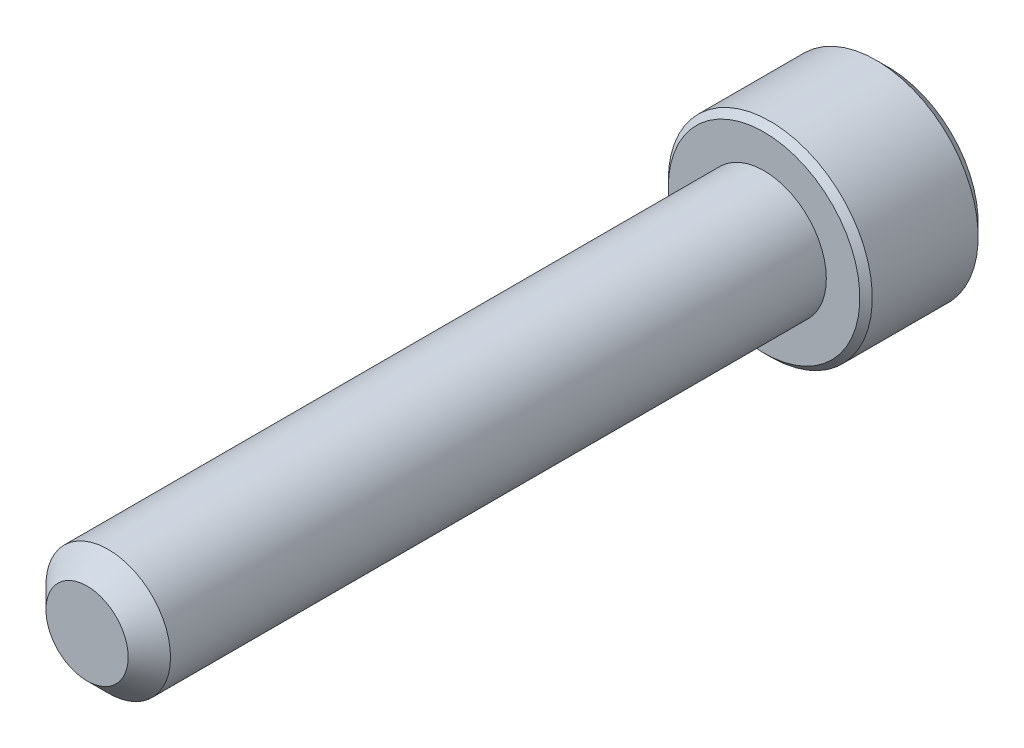
ISO-10303-21;
HEADER;
FILE_DESCRIPTION(('STEP AP214'),'2;1');
FILE_NAME('part.step','',(''),(''),'','','');
FILE_SCHEMA(('AUTOMOTIVE_DESIGN { 1 0 10303 214 1 1 1 1 }'));
ENDSEC;
DATA;
#1=APPLICATION_CONTEXT('core data for automotive mechanical design processes');
#2=APPLICATION_PROTOCOL_DEFINITION('international standard','automotive_design',2000,#1);
#3=PRODUCT_CONTEXT('',#1,'mechanical');
#4=PRODUCT('Part','Part','',(#3));
#5=PRODUCT_RELATED_PRODUCT_CATEGORY('part','',(#4));
#6=PRODUCT_DEFINITION_FORMATION('','',#4);
#7=PRODUCT_DEFINITION_CONTEXT('part definition',#1,'design');
#8=PRODUCT_DEFINITION('design','',#6,#7);
#9=PRODUCT_DEFINITION_SHAPE('','',#8);
#10=(LENGTH_UNIT() NAMED_UNIT(*) SI_UNIT(.MILLI.,.METRE.));
#11=(NAMED_UNIT(*) PLANE_ANGLE_UNIT() SI_UNIT($,.RADIAN.));
#12=(NAMED_UNIT(*) SI_UNIT($,.STERADIAN.) SOLID_ANGLE_UNIT());
#13=UNCERTAINTY_MEASURE_WITH_UNIT(LENGTH_MEASURE(1.E-05),#10,'distance_accuracy_value','');
#14=(GEOMETRIC_REPRESENTATION_CONTEXT(3) GLOBAL_UNCERTAINTY_ASSIGNED_CONTEXT((#13)) GLOBAL_UNIT_ASSIGNED_CONTEXT((#10,
#11,#12)) REPRESENTATION_CONTEXT('',''));
#15=CARTESIAN_POINT('',(0.,0.,0.));
#16=DIRECTION('',(0.,0.,1.));
#17=DIRECTION('',(1.,0.,0.));
#18=AXIS2_PLACEMENT_3D('',#15,#16,#17);
#19=CARTESIAN_POINT('',(0.,0.,-19.05));
#20=DIRECTION('',(0.,0.,1.));
#21=DIRECTION('',(1.,0.,0.));
#22=AXIS2_PLACEMENT_3D('',#19,#20,#21);
#23=CYLINDRICAL_SURFACE('',#22,1.7526);
#24=CARTESIAN_POINT('',(0.,0.,-0.595312499999997));
#25=DIRECTION('',(0.,0.,1.));
#26=DIRECTION('',(1.,0.,0.));
#27=AXIS2_PLACEMENT_3D('',#24,#25,#26);
#28=CIRCLE('',#27,1.7526);
#29=CARTESIAN_POINT('',(1.7526,0.,-0.5953125));
#30=VERTEX_POINT('',#29);
#31=EDGE_CURVE('E110',#30,#30,#28,.F.);
#32=CARTESIAN_POINT('',(0.,0.,-19.05));
#33=DIRECTION('',(0.,0.,-1.));
#34=DIRECTION('',(-1.,0.,0.));
#35=AXIS2_PLACEMENT_3D('',#32,#33,#34);
#36=CIRCLE('',#35,1.7526);
#37=CARTESIAN_POINT('',(1.7526,0.,-19.05));
#38=VERTEX_POINT('',#37);
#39=EDGE_CURVE('E210',#38,#38,#36,.F.);
#40=CARTESIAN_POINT('',(1.7526,0.,-0.5953125));
#41=CARTESIAN_POINT('',(1.7526,0.,-0.787548828125001));
#42=CARTESIAN_POINT('',(1.7526,0.,-0.979785156250001));
#43=CARTESIAN_POINT('',(1.7526,0.,-1.3642578125));
#44=CARTESIAN_POINT('',(1.7526,0.,-1.556494140625));
#45=CARTESIAN_POINT('',(1.7526,0.,-1.940966796875));
#46=CARTESIAN_POINT('',(1.7526,0.,-2.133203125));
#47=CARTESIAN_POINT('',(1.7526,0.,-2.51767578125));
#48=CARTESIAN_POINT('',(1.7526,0.,-2.709912109375));
#49=CARTESIAN_POINT('',(1.7526,0.,-3.094384765625));
#50=CARTESIAN_POINT('',(1.7526,0.,-3.28662109375));
#51=CARTESIAN_POINT('',(1.7526,0.,-3.67109375));
#52=CARTESIAN_POINT('',(1.7526,0.,-3.863330078125));
#53=CARTESIAN_POINT('',(1.7526,0.,-4.247802734375));
#54=CARTESIAN_POINT('',(1.7526,0.,-4.4400390625));
#55=CARTESIAN_POINT('',(1.7526,0.,-4.82451171875));
#56=CARTESIAN_POINT('',(1.7526,0.,-5.016748046875));
#57=CARTESIAN_POINT('',(1.7526,0.,-5.401220703125));
#58=CARTESIAN_POINT('',(1.7526,0.,-5.59345703125));
#59=CARTESIAN_POINT('',(1.7526,0.,-5.9779296875));
#60=CARTESIAN_POINT('',(1.7526,0.,-6.170166015625));
#61=CARTESIAN_POINT('',(1.7526,0.,-6.554638671875));
#62=CARTESIAN_POINT('',(1.7526,0.,-6.746875));
#63=CARTESIAN_POINT('',(1.7526,0.,-7.13134765625));
#64=CARTESIAN_POINT('',(1.7526,0.,-7.323583984375));
#65=CARTESIAN_POINT('',(1.7526,0.,-7.708056640625));
#66=CARTESIAN_POINT('',(1.7526,0.,-7.90029296875));
#67=CARTESIAN_POINT('',(1.7526,0.,-8.284765625));
#68=CARTESIAN_POINT('',(1.7526,0.,-8.477001953125));
#69=CARTESIAN_POINT('',(1.7526,0.,-8.861474609375));
#70=CARTESIAN_POINT('',(1.7526,0.,-9.0537109375));
#71=CARTESIAN_POINT('',(1.7526,0.,-9.43818359375));
#72=CARTESIAN_POINT('',(1.7526,0.,-9.630419921875));
#73=CARTESIAN_POINT('',(1.7526,0.,-10.014892578125));
#74=CARTESIAN_POINT('',(1.7526,0.,-10.20712890625));
#75=CARTESIAN_POINT('',(1.7526,0.,-10.5916015625));
#76=CARTESIAN_POINT('',(1.7526,0.,-10.783837890625));
#77=CARTESIAN_POINT('',(1.7526,0.,-11.168310546875));
#78=CARTESIAN_POINT('',(1.7526,0.,-11.360546875));
#79=CARTESIAN_POINT('',(1.7526,0.,-11.74501953125));
#80=CARTESIAN_POINT('',(1.7526,0.,-11.937255859375));
#81=CARTESIAN_POINT('',(1.7526,0.,-12.321728515625));
#82=CARTESIAN_POINT('',(1.7526,0.,-12.51396484375));
#83=CARTESIAN_POINT('',(1.7526,0.,-12.8984375));
#84=CARTESIAN_POINT('',(1.7526,0.,-13.090673828125));
#85=CARTESIAN_POINT('',(1.7526,0.,-13.475146484375));
#86=CARTESIAN_POINT('',(1.7526,0.,-13.6673828125));
#87=CARTESIAN_POINT('',(1.7526,0.,-14.05185546875));
#88=CARTESIAN_POINT('',(1.7526,0.,-14.244091796875));
#89=CARTESIAN_POINT('',(1.7526,0.,-14.628564453125));
#90=CARTESIAN_POINT('',(1.7526,0.,-14.82080078125));
#91=CARTESIAN_POINT('',(1.7526,0.,-15.2052734375));
#92=CARTESIAN_POINT('',(1.7526,0.,-15.397509765625));
#93=CARTESIAN_POINT('',(1.7526,0.,-15.781982421875));
#94=CARTESIAN_POINT('',(1.7526,0.,-15.97421875));
#95=CARTESIAN_POINT('',(1.7526,0.,-16.35869140625));
#96=CARTESIAN_POINT('',(1.7526,0.,-16.550927734375));
#97=CARTESIAN_POINT('',(1.7526,0.,-16.935400390625));
#98=CARTESIAN_POINT('',(1.7526,0.,-17.12763671875));
#99=CARTESIAN_POINT('',(1.7526,0.,-17.512109375));
#100=CARTESIAN_POINT('',(1.7526,0.,-17.704345703125));
#101=CARTESIAN_POINT('',(1.7526,0.,-18.088818359375));
#102=CARTESIAN_POINT('',(1.7526,0.,-18.2810546875));
#103=CARTESIAN_POINT('',(1.7526,0.,-18.66552734375));
#104=CARTESIAN_POINT('',(1.7526,0.,-18.857763671875));
#105=CARTESIAN_POINT('',(1.7526,0.,-19.05));
#106=B_SPLINE_CURVE_WITH_KNOTS('',3,(#40,#41,#42,#43,#44,#45,#46,#47,#48,#49,#50,#51,#52,#53,
#54,#55,#56,#57,#58,#59,#60,#61,#62,#63,#64,#65,#66,#67,#68,#69,#70,#71,#72,#73,#74,#75,#76,#77,
#78,#79,#80,#81,#82,#83,#84,#85,#86,#87,#88,#89,#90,#91,#92,#93,#94,#95,#96,#97,#98,#99,#100,
#101,#102,#103,#104,#105),.UNSPECIFIED.,.F.,.F.,(4,2,2,2,2,2,2,2,2,2,2,2,2,2,2,2,2,2,2,2,2,2,2,
2,2,2,2,2,2,2,2,2,4),(0.,0.576708984375,1.15341796875,1.730126953125,2.3068359375,
2.883544921875,3.46025390625,4.036962890625,4.613671875,5.190380859375,5.76708984375,
6.343798828125,6.9205078125,7.497216796875,8.07392578125,8.650634765625,9.22734375,
9.804052734375,10.38076171875,10.957470703125,11.5341796875,12.110888671875,12.68759765625,
13.264306640625,13.841015625,14.417724609375,14.99443359375,15.571142578125,16.1478515625,
16.724560546875,17.30126953125,17.877978515625,18.4546875),.UNSPECIFIED.);
#107=EDGE_CURVE('BSEAM36',#30,#38,#106,.T.);
#108=ORIENTED_EDGE('',*,*,#31,.T.);
#109=ORIENTED_EDGE('',*,*,#39,.T.);
#110=ORIENTED_EDGE('',*,*,#107,.T.);
#111=ORIENTED_EDGE('',*,*,#107,.F.);
#112=EDGE_LOOP('',(#108,#110,#109,#111));
#113=FACE_BOUND('',#112,.T.);
#114=ADVANCED_FACE('F36',(#113),#23,.T.);
#115=CARTESIAN_POINT('',(0.,0.,0.));
#116=DIRECTION('',(0.,0.,1.));
#117=DIRECTION('',(1.,0.,0.));
#118=AXIS2_PLACEMENT_3D('',#115,#116,#117);
#119=PLANE('',#118);
#120=CARTESIAN_POINT('',(0.,0.,0.));
#121=DIRECTION('',(0.,0.,1.));
#122=DIRECTION('',(1.,0.,0.));
#123=AXIS2_PLACEMENT_3D('',#120,#121,#122);
#124=CIRCLE('',#123,1.1572875);
#125=CARTESIAN_POINT('',(1.1572875,0.,0.));
#126=VERTEX_POINT('',#125);
#127=EDGE_CURVE('E209',#126,#126,#124,.T.);
#128=ORIENTED_EDGE('',*,*,#127,.T.);
#129=EDGE_LOOP('',(#128));
#130=FACE_BOUND('',#129,.T.);
#131=ADVANCED_FACE('F187',(#130),#119,.T.);
#132=CARTESIAN_POINT('',(0.,0.,0.));
#133=DIRECTION('',(0.,0.,-1.));
#134=DIRECTION('',(-1.,0.,0.));
#135=AXIS2_PLACEMENT_3D('',#132,#133,#134);
#136=CONICAL_SURFACE('',#135,1.1572875,0.785398163397454);
#137=ORIENTED_EDGE('',*,*,#31,.F.);
#138=EDGE_LOOP('',(#137));
#139=FACE_BOUND('',#138,.T.);
#140=ORIENTED_EDGE('',*,*,#127,.F.);
#141=EDGE_LOOP('',(#140));
#142=FACE_BOUND('',#141,.T.);
#143=ADVANCED_FACE('F193',(#139,#142),#136,.T.);
#144=CARTESIAN_POINT('',(0.,0.,-22.5552));
#145=DIRECTION('',(0.,0.,1.));
#146=DIRECTION('',(1.,0.,0.));
#147=AXIS2_PLACEMENT_3D('',#144,#145,#146);
#148=CYLINDRICAL_SURFACE('',#147,2.8702);
#149=CARTESIAN_POINT('',(0.,0.,-19.22526));
#150=DIRECTION('',(0.,0.,-1.));
#151=DIRECTION('',(-1.,0.,0.));
#152=AXIS2_PLACEMENT_3D('',#149,#150,#151);
#153=CIRCLE('',#152,2.8702);
#154=CARTESIAN_POINT('',(-2.8702,0.,-19.22526));
#155=VERTEX_POINT('',#154);
#156=EDGE_CURVE('E44',#155,#155,#153,.T.);
#157=ORIENTED_EDGE('',*,*,#156,.T.);
#158=EDGE_LOOP('',(#157));
#159=FACE_BOUND('',#158,.T.);
#160=CARTESIAN_POINT('',(0.,0.,-22.20468));
#161=DIRECTION('',(0.,0.,-1.));
#162=DIRECTION('',(-1.,0.,0.));
#163=AXIS2_PLACEMENT_3D('',#160,#161,#162);
#164=CIRCLE('',#163,2.8702);
#165=CARTESIAN_POINT('',(-2.8702,0.,-22.20468));
#166=VERTEX_POINT('',#165);
#167=EDGE_CURVE('E170',#166,#166,#164,.F.);
#168=ORIENTED_EDGE('',*,*,#167,.T.);
#169=EDGE_LOOP('',(#168));
#170=FACE_BOUND('',#169,.T.);
#171=ADVANCED_FACE('F175',(#159,#170),#148,.T.);
#172=CARTESIAN_POINT('',(0.,0.,-22.5552));
#173=DIRECTION('',(0.,0.,-1.));
#174=DIRECTION('',(-1.,0.,0.));
#175=AXIS2_PLACEMENT_3D('',#172,#173,#174);
#176=PLANE('',#175);
#177=CARTESIAN_POINT('',(0.,0.,-22.5552));
#178=DIRECTION('',(0.,0.,-1.));
#179=DIRECTION('',(-1.,0.,0.));
#180=AXIS2_PLACEMENT_3D('',#177,#178,#179);
#181=CIRCLE('',#180,2.51968);
#182=CARTESIAN_POINT('',(-2.51968,0.,-22.5552));
#183=VERTEX_POINT('',#182);
#184=EDGE_CURVE('E109',#183,#183,#181,.T.);
#185=ORIENTED_EDGE('',*,*,#184,.T.);
#186=EDGE_LOOP('',(#185));
#187=FACE_BOUND('',#186,.T.);
#188=CARTESIAN_POINT('',(0.,0.,-22.5552));
#189=DIRECTION('',(0.,0.,-1.));
#190=DIRECTION('',(-1.,0.,0.));
#191=AXIS2_PLACEMENT_3D('',#188,#189,#190);
#192=CIRCLE('',#191,1.60395121659243);
#193=CARTESIAN_POINT('',(-1.3890625,0.801975608296217,-22.5552));
#194=VERTEX_POINT('',#193);
#195=CARTESIAN_POINT('',(0.,1.60395121659243,-22.5552));
#196=VERTEX_POINT('',#195);
#197=EDGE_CURVE('E90',#194,#196,#192,.T.);
#198=ORIENTED_EDGE('',*,*,#197,.F.);
#199=CARTESIAN_POINT('',(-1.3890625,-0.801975608296215,-22.5552));
#200=VERTEX_POINT('',#199);
#201=EDGE_CURVE('E50',#200,#194,#192,.T.);
#202=ORIENTED_EDGE('',*,*,#201,.F.);
#203=CARTESIAN_POINT('',(0.,-1.60395121659243,-22.5552));
#204=VERTEX_POINT('',#203);
#205=EDGE_CURVE('E266',#204,#200,#192,.T.);
#206=ORIENTED_EDGE('',*,*,#205,.F.);
#207=CARTESIAN_POINT('',(1.3890625,-0.801975608296215,-22.5552));
#208=VERTEX_POINT('',#207);
#209=EDGE_CURVE('E57',#208,#204,#192,.T.);
#210=ORIENTED_EDGE('',*,*,#209,.F.);
#211=CARTESIAN_POINT('',(1.3890625,0.801975608296215,-22.5552));
#212=VERTEX_POINT('',#211);
#213=EDGE_CURVE('E131',#212,#208,#192,.T.);
#214=ORIENTED_EDGE('',*,*,#213,.F.);
#215=EDGE_CURVE('E99',#196,#212,#192,.T.);
#216=ORIENTED_EDGE('',*,*,#215,.F.);
#217=EDGE_LOOP('',(#198,#202,#206,#210,#214,#216));
#218=FACE_BOUND('',#217,.T.);
#219=ADVANCED_FACE('F130',(#187,#218),#176,.T.);
#220=CARTESIAN_POINT('',(0.,0.,-19.05));
#221=DIRECTION('',(0.,0.,-1.));
#222=DIRECTION('',(-1.,0.,0.));
#223=AXIS2_PLACEMENT_3D('',#220,#221,#222);
#224=PLANE('',#223);
#225=CARTESIAN_POINT('',(0.,0.,-19.05));
#226=DIRECTION('',(0.,0.,-1.));
#227=DIRECTION('',(-1.,0.,0.));
#228=AXIS2_PLACEMENT_3D('',#225,#226,#227);
#229=CIRCLE('',#228,2.69494);
#230=CARTESIAN_POINT('',(-2.69494,0.,-19.05));
#231=VERTEX_POINT('',#230);
#232=EDGE_CURVE('E12',#231,#231,#229,.F.);
#233=ORIENTED_EDGE('',*,*,#232,.T.);
#234=EDGE_LOOP('',(#233));
#235=FACE_BOUND('',#234,.T.);
#236=ORIENTED_EDGE('',*,*,#39,.F.);
#237=EDGE_LOOP('',(#236));
#238=FACE_BOUND('',#237,.T.);
#239=ADVANCED_FACE('F278',(#235,#238),#224,.F.);
#240=CARTESIAN_POINT('',(0.,0.,-22.5552));
#241=DIRECTION('',(0.,0.,-1.));
#242=DIRECTION('',(-1.,0.,0.));
#243=AXIS2_PLACEMENT_3D('',#240,#241,#242);
#244=CONICAL_SURFACE('',#243,1.60395121659243,0.78539816339745);
#245=ORIENTED_EDGE('',*,*,#215,.T.);
#246=CARTESIAN_POINT('',(-0.000200000000000534,1.60406668664627,-22.5553154825222));
#247=CARTESIAN_POINT('',(0.0475548148995851,1.57649543140889,-22.5277647868811));
#248=CARTESIAN_POINT('',(0.0961082129767667,1.54846311395896,-22.5018319141145));
#249=CARTESIAN_POINT('',(0.195114281423183,1.49130193369001,-22.4543489608708));
#250=CARTESIAN_POINT('',(0.245576372730139,1.46216763169007,-22.4328253080794));
#251=CARTESIAN_POINT('',(0.347330835284908,1.40341966534283,-22.3959546019866));
#252=CARTESIAN_POINT('',(0.398597278416374,1.37382097060048,-22.3805148513149));
#253=CARTESIAN_POINT('',(0.502259069123937,1.31397180783079,-22.3567264581829));
#254=CARTESIAN_POINT('',(0.554651247789432,1.28372316937484,-22.3483600517165));
#255=CARTESIAN_POINT('',(0.644944084544834,1.23159257576821,-22.3408113663708));
#256=CARTESIAN_POINT('',(0.6827280342556,1.20977800223165,-22.3396936971037));
#257=CARTESIAN_POINT('',(0.758229287800437,1.16618733317339,-22.3415750513552));
#258=CARTESIAN_POINT('',(0.795946575086517,1.14441124720567,-22.3445749834252));
#259=CARTESIAN_POINT('',(0.87101801890652,1.10106872890774,-22.3545189567457));
#260=CARTESIAN_POINT('',(0.908371804329553,1.0795025108385,-22.3614666704902));
#261=CARTESIAN_POINT('',(0.98245243559604,1.03673203843505,-22.3789288810594));
#262=CARTESIAN_POINT('',(1.01917900521513,1.01552794357906,-22.3894449088769));
#263=CARTESIAN_POINT('',(1.11325413716703,0.961213640822578,-22.4206664203823));
#264=CARTESIAN_POINT('',(1.17001916310317,0.928440337817795,-22.4437263608604));
#265=CARTESIAN_POINT('',(1.25348479270274,0.880251434100403,-22.4826547118294));
#266=CARTESIAN_POINT('',(1.28098915116073,0.864371785340791,-22.4963318145832));
#267=CARTESIAN_POINT('',(1.33549195495674,0.832904576897577,-22.5249348081189));
#268=CARTESIAN_POINT('',(1.36249063449213,0.817316882000056,-22.5398601023926));
#269=CARTESIAN_POINT('',(1.3892625,0.801860138242377,-22.5553154825221));
#270=B_SPLINE_CURVE_WITH_KNOTS('',3,(#246,#247,#248,#249,#250,#251,#252,#253,#254,#255,#256,
#257,#258,#259,#260,#261,#262,#263,#264,#265,#266,#267,#268,#269),.UNSPECIFIED.,.F.,.F.,(4,2,2,
2,2,2,2,2,2,2,2,4),(0.,0.185054161583333,0.371186974731966,0.554362620151554,0.737076859824673,
0.867821902366107,0.998595798526818,1.12949154907136,1.26044353188444,1.46846066168042,
1.57218026599103,1.67585058309997),.UNSPECIFIED.);
#271=EDGE_CURVE('E104',#196,#212,#270,.T.);
#272=ORIENTED_EDGE('',*,*,#271,.F.);
#273=EDGE_LOOP('',(#245,#272));
#274=FACE_BOUND('',#273,.T.);
#275=ADVANCED_FACE('F105',(#274),#244,.F.);
#276=ORIENTED_EDGE('',*,*,#213,.T.);
#277=CARTESIAN_POINT('',(1.3890625,-1.61940394480745,-23.0847819482223));
#278=CARTESIAN_POINT('',(1.3890625,-1.58006115349146,-23.0549243271923));
#279=CARTESIAN_POINT('',(1.3890625,-1.54050132955006,-23.0253535181349));
#280=CARTESIAN_POINT('',(1.3890625,-1.46085876241779,-22.9669045446385));
#281=CARTESIAN_POINT('',(1.3890625,-1.42077589246553,-22.9380265531062));
#282=CARTESIAN_POINT('',(1.3890625,-1.29902274997118,-22.8521982113368));
#283=CARTESIAN_POINT('',(1.3890625,-1.21644571524143,-22.7965129842253));
#284=CARTESIAN_POINT('',(1.3890625,-1.04315507977619,-22.6870119606919));
#285=CARTESIAN_POINT('',(1.3890625,-0.952248476193911,-22.633498197639));
#286=CARTESIAN_POINT('',(1.3890625,-0.765869525131636,-22.5354818620338));
#287=CARTESIAN_POINT('',(1.3890625,-0.670413981853179,-22.4909488871386));
#288=CARTESIAN_POINT('',(1.3890625,-0.527324185824119,-22.4364610332754));
#289=CARTESIAN_POINT('',(1.3890625,-0.481850777039667,-22.4208565157759));
#290=CARTESIAN_POINT('',(1.3890625,-0.389788715477724,-22.3932958930188));
#291=CARTESIAN_POINT('',(1.3890625,-0.34319998777442,-22.3813400336196));
#292=CARTESIAN_POINT('',(1.3890625,-0.249973786412085,-22.3619026508989));
#293=CARTESIAN_POINT('',(1.3890625,-0.20335281289058,-22.3543432373455));
#294=CARTESIAN_POINT('',(1.3890625,-0.109590268814354,-22.3438495716361));
#295=CARTESIAN_POINT('',(1.3890625,-0.0624487940539217,-22.3409144822393));
#296=CARTESIAN_POINT('',(1.3890625,0.0300876528594538,-22.3398959870312));
#297=CARTESIAN_POINT('',(1.3890625,0.0754806899085092,-22.3416318778689));
#298=CARTESIAN_POINT('',(1.3890625,0.165887420036847,-22.3494562074487));
#299=CARTESIAN_POINT('',(1.3890625,0.210901076451833,-22.3555450621007));
#300=CARTESIAN_POINT('',(1.3890625,0.300985584808155,-22.3718429071109));
#301=CARTESIAN_POINT('',(1.3890625,0.346043426477339,-22.3821227134166));
#302=CARTESIAN_POINT('',(1.3890625,0.435171985795336,-22.4062501165965));
#303=CARTESIAN_POINT('',(1.3890625,0.479242778772565,-22.4200974401937));
#304=CARTESIAN_POINT('',(1.3890625,0.61709785513739,-22.4686456952925));
#305=CARTESIAN_POINT('',(1.3890625,0.708943143387238,-22.5088382623019));
#306=CARTESIAN_POINT('',(1.3890625,0.888326863327376,-22.5982263268257));
#307=CARTESIAN_POINT('',(1.3890625,0.97584844310253,-22.6474539890072));
#308=CARTESIAN_POINT('',(1.3890625,1.14312734298093,-22.749041791674));
#309=CARTESIAN_POINT('',(1.3890625,1.22305448923177,-22.8011257684336));
#310=CARTESIAN_POINT('',(1.3890625,1.3408107215704,-22.8816537579098));
#311=CARTESIAN_POINT('',(1.3890625,1.37955507371222,-22.9087826125004));
#312=CARTESIAN_POINT('',(1.3890625,1.4565136416918,-22.96376083201));
#313=CARTESIAN_POINT('',(1.3890625,1.49472800051003,-22.9916099965591));
#314=CARTESIAN_POINT('',(1.3890625,1.53272159252287,-23.019757934727));
#315=B_SPLINE_CURVE_WITH_KNOTS('',3,(#277,#278,#279,#280,#281,#282,#283,#284,#285,#286,#287,
#288,#289,#290,#291,#292,#293,#294,#295,#296,#297,#298,#299,#300,#301,#302,#303,#304,#305,#306,
#307,#308,#309,#310,#311,#312,#313,#314),.UNSPECIFIED.,.F.,.F.,(4,2,2,2,2,2,2,2,2,2,2,2,2,2,2,2,
2,2,4),(0.,0.148165097735296,0.296366796320979,0.595030749860533,0.911241326915099,
1.22636278192646,1.37047020890679,1.51458734417271,1.65606664391464,1.79752032566969,
1.93358111293096,2.06965490204564,2.20813012759239,2.34659474888992,2.64647835597473,
2.94745101021194,3.23350725563862,3.37539574691567,3.51724518455275),.UNSPECIFIED.);
#316=EDGE_CURVE('E98',#212,#208,#315,.F.);
#317=ORIENTED_EDGE('',*,*,#316,.F.);
#318=EDGE_LOOP('',(#276,#317));
#319=FACE_BOUND('',#318,.T.);
#320=ADVANCED_FACE('F272',(#319),#244,.F.);
#321=ORIENTED_EDGE('',*,*,#209,.T.);
#322=CARTESIAN_POINT('',(1.3892625,-0.801860138242376,-22.5553154825221));
#323=CARTESIAN_POINT('',(1.34150768510041,-0.829431393479753,-22.527764786881));
#324=CARTESIAN_POINT('',(1.29295428702323,-0.857463710929685,-22.5018319141145));
#325=CARTESIAN_POINT('',(1.19394821857682,-0.91462489119863,-22.4543489608708));
#326=CARTESIAN_POINT('',(1.14348612726986,-0.943759193198573,-22.4328253080794));
#327=CARTESIAN_POINT('',(1.04173166471509,-1.00250715954581,-22.3959546019866));
#328=CARTESIAN_POINT('',(0.990465221583625,-1.03210585428816,-22.3805148513149));
#329=CARTESIAN_POINT('',(0.886803430876063,-1.09195501705785,-22.3567264581829));
#330=CARTESIAN_POINT('',(0.834411252210569,-1.1222036555138,-22.3483600517165));
#331=CARTESIAN_POINT('',(0.744118415455167,-1.17433424912043,-22.3408113663708));
#332=CARTESIAN_POINT('',(0.706334465744401,-1.19614882265699,-22.3396936971037));
#333=CARTESIAN_POINT('',(0.630833212199565,-1.23973949171525,-22.3415750513552));
#334=CARTESIAN_POINT('',(0.593115924913484,-1.26151557768297,-22.3445749834252));
#335=CARTESIAN_POINT('',(0.518044481093482,-1.30485809598091,-22.3545189567457));
#336=CARTESIAN_POINT('',(0.480690695670449,-1.32642431405015,-22.3614666704902));
#337=CARTESIAN_POINT('',(0.406610064403962,-1.36919478645359,-22.3789288810594));
#338=CARTESIAN_POINT('',(0.369883494784874,-1.39039888130958,-22.3894449088769));
#339=CARTESIAN_POINT('',(0.275808362832968,-1.44471318406606,-22.4206664203823));
#340=CARTESIAN_POINT('',(0.219043336896833,-1.47748648707085,-22.4437263608604));
#341=CARTESIAN_POINT('',(0.135577707297264,-1.52567539078824,-22.4826547118294));
#342=CARTESIAN_POINT('',(0.108073348839269,-1.54155503954785,-22.4963318145832));
#343=CARTESIAN_POINT('',(0.0535705450432624,-1.57302224799107,-22.5249348081189));
#344=CARTESIAN_POINT('',(0.0265718655078741,-1.58860994288859,-22.5398601023926));
#345=CARTESIAN_POINT('',(-0.000199999999998959,-1.60406668664627,-22.5553154825221));
#346=B_SPLINE_CURVE_WITH_KNOTS('',3,(#322,#323,#324,#325,#326,#327,#328,#329,#330,#331,#332,
#333,#334,#335,#336,#337,#338,#339,#340,#341,#342,#343,#344,#345),.UNSPECIFIED.,.F.,.F.,(4,2,2,
2,2,2,2,2,2,2,2,4),(0.,0.185054161583331,0.371186974731966,0.554362620151551,0.737076859824669,
0.867821902366103,0.998595798526814,1.12949154907136,1.26044353188443,1.46846066168042,
1.57218026599103,1.67585058309997),.UNSPECIFIED.);
#347=EDGE_CURVE('E140',#208,#204,#346,.T.);
#348=ORIENTED_EDGE('',*,*,#347,.F.);
#349=EDGE_LOOP('',(#321,#348));
#350=FACE_BOUND('',#349,.T.);
#351=ADVANCED_FACE('F269',(#350),#244,.F.);
#352=ORIENTED_EDGE('',*,*,#205,.T.);
#353=CARTESIAN_POINT('',(0.000199999999999772,-1.60406668664627,-22.5553154825221));
#354=CARTESIAN_POINT('',(-0.047554814899586,-1.57649543140889,-22.527764786881));
#355=CARTESIAN_POINT('',(-0.0961082129767678,-1.54846311395896,-22.5018319141145));
#356=CARTESIAN_POINT('',(-0.195114281423185,-1.49130193369001,-22.4543489608708));
#357=CARTESIAN_POINT('',(-0.245576372730141,-1.46216763169007,-22.4328253080794));
#358=CARTESIAN_POINT('',(-0.34733083528491,-1.40341966534283,-22.3959546019866));
#359=CARTESIAN_POINT('',(-0.398597278416375,-1.37382097060048,-22.3805148513149));
#360=CARTESIAN_POINT('',(-0.502259069123937,-1.31397180783079,-22.3567264581829));
#361=CARTESIAN_POINT('',(-0.55465124778943,-1.28372316937484,-22.3483600517165));
#362=CARTESIAN_POINT('',(-0.644944084544832,-1.23159257576821,-22.3408113663708));
#363=CARTESIAN_POINT('',(-0.682728034255598,-1.20977800223165,-22.3396936971037));
#364=CARTESIAN_POINT('',(-0.758229287800435,-1.16618733317339,-22.3415750513552));
#365=CARTESIAN_POINT('',(-0.795946575086516,-1.14441124720567,-22.3445749834252));
#366=CARTESIAN_POINT('',(-0.871018018906518,-1.10106872890774,-22.3545189567457));
#367=CARTESIAN_POINT('',(-0.908371804329551,-1.0795025108385,-22.3614666704902));
#368=CARTESIAN_POINT('',(-0.982452435596038,-1.03673203843505,-22.3789288810594));
#369=CARTESIAN_POINT('',(-1.01917900521513,-1.01552794357906,-22.3894449088769));
#370=CARTESIAN_POINT('',(-1.11325413716703,-0.961213640822578,-22.4206664203823));
#371=CARTESIAN_POINT('',(-1.17001916310317,-0.928440337817794,-22.4437263608604));
#372=CARTESIAN_POINT('',(-1.25348479270274,-0.880251434100402,-22.4826547118294));
#373=CARTESIAN_POINT('',(-1.28098915116073,-0.86437178534079,-22.4963318145832));
#374=CARTESIAN_POINT('',(-1.33549195495674,-0.832904576897577,-22.5249348081189));
#375=CARTESIAN_POINT('',(-1.36249063449213,-0.817316882000056,-22.5398601023926));
#376=CARTESIAN_POINT('',(-1.3892625,-0.801860138242377,-22.5553154825221));
#377=B_SPLINE_CURVE_WITH_KNOTS('',3,(#353,#354,#355,#356,#357,#358,#359,#360,#361,#362,#363,
#364,#365,#366,#367,#368,#369,#370,#371,#372,#373,#374,#375,#376),.UNSPECIFIED.,.F.,.F.,(4,2,2,
2,2,2,2,2,2,2,2,4),(0.,0.185054161583332,0.371186974731966,0.554362620151552,0.737076859824669,
0.867821902366103,0.998595798526814,1.12949154907136,1.26044353188443,1.46846066168042,
1.57218026599103,1.67585058309997),.UNSPECIFIED.);
#378=EDGE_CURVE('E244',#204,#200,#377,.T.);
#379=ORIENTED_EDGE('',*,*,#378,.F.);
#380=EDGE_LOOP('',(#352,#379));
#381=FACE_BOUND('',#380,.T.);
#382=ADVANCED_FACE('F268',(#381),#244,.F.);
#383=ORIENTED_EDGE('',*,*,#201,.T.);
#384=CARTESIAN_POINT('',(-1.3890625,-1.61940394489368,-23.0847819482877));
#385=CARTESIAN_POINT('',(-1.3890625,-1.58006115357525,-23.0549243272552));
#386=CARTESIAN_POINT('',(-1.3890625,-1.54050132963141,-23.0253535181953));
#387=CARTESIAN_POINT('',(-1.3890625,-1.46085876249422,-22.9669045446939));
#388=CARTESIAN_POINT('',(-1.3890625,-1.42077589253949,-22.9380265531591));
#389=CARTESIAN_POINT('',(-1.3890625,-1.29902275003757,-22.8521982113821));
#390=CARTESIAN_POINT('',(-1.3890625,-1.21644571530268,-22.7965129842656));
#391=CARTESIAN_POINT('',(-1.3890625,-1.04315507982623,-22.6870119607219));
#392=CARTESIAN_POINT('',(-1.3890625,-0.952248476237844,-22.6334981976636));
#393=CARTESIAN_POINT('',(-1.3890625,-0.765869525162843,-22.5354818620486));
#394=CARTESIAN_POINT('',(-1.3890625,-0.670413981877767,-22.490948887149));
#395=CARTESIAN_POINT('',(-1.3890625,-0.527324185843738,-22.4364610332824));
#396=CARTESIAN_POINT('',(-1.3890625,-0.481850777061386,-22.4208565157831));
#397=CARTESIAN_POINT('',(-1.3890625,-0.389788715503717,-22.3932958930258));
#398=CARTESIAN_POINT('',(-1.3890625,-0.343199987802587,-22.3813400336264));
#399=CARTESIAN_POINT('',(-1.3890625,-0.249973786444529,-22.3619026509047));
#400=CARTESIAN_POINT('',(-1.3890625,-0.203352812925126,-22.3543432373505));
#401=CARTESIAN_POINT('',(-1.3890625,-0.109590268853037,-22.3438495716392));
#402=CARTESIAN_POINT('',(-1.3890625,-0.0624487940946412,-22.3409144822412));
#403=CARTESIAN_POINT('',(-1.3890625,0.0300876528150609,-22.3398959870303));
#404=CARTESIAN_POINT('',(-1.3890625,0.0754806898624732,-22.3416318778665));
#405=CARTESIAN_POINT('',(-1.3890625,0.165887419987694,-22.3494562074429));
#406=CARTESIAN_POINT('',(-1.3890625,0.210901076401206,-22.3555450620931));
#407=CARTESIAN_POINT('',(-1.3890625,0.300985584754619,-22.3718429070996));
#408=CARTESIAN_POINT('',(-1.3890625,0.346043426422372,-22.3821227134034));
#409=CARTESIAN_POINT('',(-1.3890625,0.435171985737648,-22.4062501165793));
#410=CARTESIAN_POINT('',(-1.3890625,0.479242778713588,-22.4200974401744));
#411=CARTESIAN_POINT('',(-1.3890625,0.61709785506566,-22.4686456952639));
#412=CARTESIAN_POINT('',(-1.3890625,0.708943143304683,-22.5088382622647));
#413=CARTESIAN_POINT('',(-1.3890625,0.888326863224002,-22.5982263267703));
#414=CARTESIAN_POINT('',(-1.3890625,0.975848442989168,-22.6474539889421));
#415=CARTESIAN_POINT('',(-1.3890625,1.14312734284962,-22.7490417915907));
#416=CARTESIAN_POINT('',(-1.3890625,1.22305448909243,-22.8011257683416));
#417=CARTESIAN_POINT('',(-1.3890625,1.34081072141919,-22.8816537578048));
#418=CARTESIAN_POINT('',(-1.3890625,1.37955507355711,-22.9087826123911));
#419=CARTESIAN_POINT('',(-1.3890625,1.45651364152892,-22.9637608318921));
#420=CARTESIAN_POINT('',(-1.3890625,1.49472800034328,-22.9916099964369));
#421=CARTESIAN_POINT('',(-1.3890625,1.53272159235225,-23.0197579346005));
#422=B_SPLINE_CURVE_WITH_KNOTS('',3,(#384,#385,#386,#387,#388,#389,#390,#391,#392,#393,#394,
#395,#396,#397,#398,#399,#400,#401,#402,#403,#404,#405,#406,#407,#408,#409,#410,#411,#412,#413,
#414,#415,#416,#417,#418,#419,#420,#421),.UNSPECIFIED.,.F.,.F.,(4,2,2,2,2,2,2,2,2,2,2,2,2,2,2,2,
2,2,4),(0.,0.148165097745704,0.296366796341797,0.595030749902561,0.911241326980938,
1.22636278201588,1.37047020899011,1.51458734424994,1.65606664398604,1.79752032573526,
1.93358111299144,2.06965490210104,2.20813012764229,2.34659474893434,2.6464783559792,
2.94745101017619,3.23350725556849,3.37539574682858,3.5172451844487),.UNSPECIFIED.);
#423=EDGE_CURVE('E120',#200,#194,#422,.T.);
#424=ORIENTED_EDGE('',*,*,#423,.F.);
#425=EDGE_LOOP('',(#383,#424));
#426=FACE_BOUND('',#425,.T.);
#427=ADVANCED_FACE('F285',(#426),#244,.F.);
#428=ORIENTED_EDGE('',*,*,#197,.T.);
#429=CARTESIAN_POINT('',(-1.3892625,0.801860138242378,-22.5553154825221));
#430=CARTESIAN_POINT('',(-1.34150768510041,0.829431393479755,-22.527764786881));
#431=CARTESIAN_POINT('',(-1.29295428702323,0.857463710929687,-22.5018319141145));
#432=CARTESIAN_POINT('',(-1.19394821857681,0.914624891198632,-22.4543489608708));
#433=CARTESIAN_POINT('',(-1.14348612726986,0.943759193198574,-22.4328253080794));
#434=CARTESIAN_POINT('',(-1.04173166471509,1.00250715954582,-22.3959546019866));
#435=CARTESIAN_POINT('',(-0.990465221583624,1.03210585428816,-22.3805148513149));
#436=CARTESIAN_POINT('',(-0.886803430876061,1.09195501705785,-22.3567264581829));
#437=CARTESIAN_POINT('',(-0.834411252210566,1.12220365551381,-22.3483600517165));
#438=CARTESIAN_POINT('',(-0.744118415455163,1.17433424912043,-22.3408113663708));
#439=CARTESIAN_POINT('',(-0.706334465744397,1.19614882265699,-22.3396936971037));
#440=CARTESIAN_POINT('',(-0.630833212199561,1.23973949171526,-22.3415750513552));
#441=CARTESIAN_POINT('',(-0.59311592491348,1.26151557768298,-22.3445749834252));
#442=CARTESIAN_POINT('',(-0.518044481093478,1.30485809598091,-22.3545189567457));
#443=CARTESIAN_POINT('',(-0.480690695670445,1.32642431405015,-22.3614666704902));
#444=CARTESIAN_POINT('',(-0.406610064403958,1.36919478645359,-22.3789288810594));
#445=CARTESIAN_POINT('',(-0.36988349478487,1.39039888130958,-22.3894449088769));
#446=CARTESIAN_POINT('',(-0.275808362832965,1.44471318406607,-22.4206664203823));
#447=CARTESIAN_POINT('',(-0.219043336896832,1.47748648707085,-22.4437263608604));
#448=CARTESIAN_POINT('',(-0.135577707297265,1.52567539078824,-22.4826547118294));
#449=CARTESIAN_POINT('',(-0.108073348839269,1.54155503954785,-22.4963318145832));
#450=CARTESIAN_POINT('',(-0.0535705450432623,1.57302224799107,-22.5249348081189));
#451=CARTESIAN_POINT('',(-0.0265718655078737,1.58860994288859,-22.5398601023926));
#452=CARTESIAN_POINT('',(0.000199999999999513,1.60406668664627,-22.5553154825221));
#453=B_SPLINE_CURVE_WITH_KNOTS('',3,(#429,#430,#431,#432,#433,#434,#435,#436,#437,#438,#439,
#440,#441,#442,#443,#444,#445,#446,#447,#448,#449,#450,#451,#452),.UNSPECIFIED.,.F.,.F.,(4,2,2,
2,2,2,2,2,2,2,2,4),(0.,0.185054161583333,0.371186974731965,0.554362620151551,0.737076859824671,
0.867821902366106,0.998595798526816,1.12949154907136,1.26044353188444,1.46846066168041,
1.57218026599103,1.67585058309996),.UNSPECIFIED.);
#454=EDGE_CURVE('E94',#194,#196,#453,.T.);
#455=ORIENTED_EDGE('',*,*,#454,.F.);
#456=EDGE_LOOP('',(#428,#455));
#457=FACE_BOUND('',#456,.T.);
#458=ADVANCED_FACE('F92',(#457),#244,.F.);
#459=CARTESIAN_POINT('',(1.3890625,2.40592682488864,-20.47160625));
#460=DIRECTION('',(0.,0.,-1.));
#461=DIRECTION('',(-1.,0.,0.));
#462=AXIS2_PLACEMENT_3D('',#459,#460,#461);
#463=PLANE('',#462);
#464=DIRECTION('',(0.866025403784439,0.5,0.));
#465=VECTOR('',#464,1.);
#466=CARTESIAN_POINT('',(-1.3890625,0.801975608296216,-20.47160625));
#467=LINE('',#466,#465);
#468=CARTESIAN_POINT('',(-1.3890625,0.801975608296216,-20.47160625));
#469=VERTEX_POINT('',#468);
#470=CARTESIAN_POINT('',(0.,1.60395121659243,-20.47160625));
#471=VERTEX_POINT('',#470);
#472=EDGE_CURVE('E119',#469,#471,#467,.T.);
#473=ORIENTED_EDGE('',*,*,#472,.T.);
#474=DIRECTION('',(0.866025403784439,-0.5,0.));
#475=VECTOR('',#474,1.);
#476=CARTESIAN_POINT('',(0.,1.60395121659243,-20.47160625));
#477=LINE('',#476,#475);
#478=CARTESIAN_POINT('',(1.3890625,0.801975608296215,-20.47160625));
#479=VERTEX_POINT('',#478);
#480=EDGE_CURVE('E124',#471,#479,#477,.T.);
#481=ORIENTED_EDGE('',*,*,#480,.T.);
#482=DIRECTION('',(0.,-1.,0.));
#483=VECTOR('',#482,1.);
#484=CARTESIAN_POINT('',(1.3890625,0.801975608296215,-20.47160625));
#485=LINE('',#484,#483);
#486=CARTESIAN_POINT('',(1.3890625,-0.801975608296214,-20.47160625));
#487=VERTEX_POINT('',#486);
#488=EDGE_CURVE('E232',#479,#487,#485,.T.);
#489=ORIENTED_EDGE('',*,*,#488,.T.);
#490=DIRECTION('',(-0.866025403784439,-0.5,0.));
#491=VECTOR('',#490,1.);
#492=CARTESIAN_POINT('',(1.3890625,-0.801975608296214,-20.47160625));
#493=LINE('',#492,#491);
#494=CARTESIAN_POINT('',(0.,-1.60395121659243,-20.47160625));
#495=VERTEX_POINT('',#494);
#496=EDGE_CURVE('E229',#487,#495,#493,.T.);
#497=ORIENTED_EDGE('',*,*,#496,.T.);
#498=DIRECTION('',(-0.866025403784439,0.5,0.));
#499=VECTOR('',#498,1.);
#500=CARTESIAN_POINT('',(0.,-1.60395121659243,-20.47160625));
#501=LINE('',#500,#499);
#502=CARTESIAN_POINT('',(-1.3890625,-0.801975608296215,-20.47160625));
#503=VERTEX_POINT('',#502);
#504=EDGE_CURVE('E226',#495,#503,#501,.T.);
#505=ORIENTED_EDGE('',*,*,#504,.T.);
#506=DIRECTION('',(0.,1.,0.));
#507=VECTOR('',#506,1.);
#508=CARTESIAN_POINT('',(-1.3890625,-0.801975608296215,-20.47160625));
#509=LINE('',#508,#507);
#510=EDGE_CURVE('E127',#503,#469,#509,.T.);
#511=ORIENTED_EDGE('',*,*,#510,.T.);
#512=EDGE_LOOP('',(#473,#481,#489,#497,#505,#511));
#513=FACE_BOUND('',#512,.T.);
#514=ADVANCED_FACE('F159',(#513),#463,.T.);
#515=CARTESIAN_POINT('',(0.,1.60395121659243,-20.47160625));
#516=DIRECTION('',(0.5,0.866025403784439,0.));
#517=DIRECTION('',(-0.866025403784439,0.5,0.));
#518=AXIS2_PLACEMENT_3D('',#515,#516,#517);
#519=PLANE('',#518);
#520=DIRECTION('',(0.,0.,-1.));
#521=VECTOR('',#520,1.);
#522=CARTESIAN_POINT('',(0.,1.60395121659243,-20.47160625));
#523=LINE('',#522,#521);
#524=EDGE_CURVE('E116',#471,#196,#523,.T.);
#525=ORIENTED_EDGE('',*,*,#524,.T.);
#526=ORIENTED_EDGE('',*,*,#271,.T.);
#527=DIRECTION('',(0.,0.,-1.));
#528=VECTOR('',#527,1.);
#529=CARTESIAN_POINT('',(1.3890625,0.801975608296215,-20.47160625));
#530=LINE('',#529,#528);
#531=EDGE_CURVE('E126',#479,#212,#530,.T.);
#532=ORIENTED_EDGE('',*,*,#531,.F.);
#533=ORIENTED_EDGE('',*,*,#480,.F.);
#534=EDGE_LOOP('',(#525,#526,#532,#533));
#535=FACE_BOUND('',#534,.T.);
#536=ADVANCED_FACE('F122',(#535),#519,.F.);
#537=CARTESIAN_POINT('',(1.3890625,0.801975608296215,-20.47160625));
#538=DIRECTION('',(1.,0.,0.));
#539=DIRECTION('',(0.,1.,0.));
#540=AXIS2_PLACEMENT_3D('',#537,#538,#539);
#541=PLANE('',#540);
#542=ORIENTED_EDGE('',*,*,#531,.T.);
#543=ORIENTED_EDGE('',*,*,#316,.T.);
#544=DIRECTION('',(0.,0.,-1.));
#545=VECTOR('',#544,1.);
#546=CARTESIAN_POINT('',(1.3890625,-0.801975608296214,-20.47160625));
#547=LINE('',#546,#545);
#548=EDGE_CURVE('E215',#487,#208,#547,.T.);
#549=ORIENTED_EDGE('',*,*,#548,.F.);
#550=ORIENTED_EDGE('',*,*,#488,.F.);
#551=EDGE_LOOP('',(#542,#543,#549,#550));
#552=FACE_BOUND('',#551,.T.);
#553=ADVANCED_FACE('F148',(#552),#541,.F.);
#554=CARTESIAN_POINT('',(1.3890625,-0.801975608296214,-20.47160625));
#555=DIRECTION('',(0.5,-0.866025403784439,0.));
#556=DIRECTION('',(0.866025403784439,0.5,0.));
#557=AXIS2_PLACEMENT_3D('',#554,#555,#556);
#558=PLANE('',#557);
#559=ORIENTED_EDGE('',*,*,#548,.T.);
#560=ORIENTED_EDGE('',*,*,#347,.T.);
#561=DIRECTION('',(0.,0.,-1.));
#562=VECTOR('',#561,1.);
#563=CARTESIAN_POINT('',(0.,-1.60395121659243,-20.47160625));
#564=LINE('',#563,#562);
#565=EDGE_CURVE('E218',#495,#204,#564,.T.);
#566=ORIENTED_EDGE('',*,*,#565,.F.);
#567=ORIENTED_EDGE('',*,*,#496,.F.);
#568=EDGE_LOOP('',(#559,#560,#566,#567));
#569=FACE_BOUND('',#568,.T.);
#570=ADVANCED_FACE('F152',(#569),#558,.F.);
#571=CARTESIAN_POINT('',(0.,-1.60395121659243,-20.47160625));
#572=DIRECTION('',(-0.5,-0.866025403784439,0.));
#573=DIRECTION('',(0.866025403784439,-0.5,0.));
#574=AXIS2_PLACEMENT_3D('',#571,#572,#573);
#575=PLANE('',#574);
#576=ORIENTED_EDGE('',*,*,#565,.T.);
#577=ORIENTED_EDGE('',*,*,#378,.T.);
#578=DIRECTION('',(0.,0.,-1.));
#579=VECTOR('',#578,1.);
#580=CARTESIAN_POINT('',(-1.3890625,-0.801975608296215,-20.47160625));
#581=LINE('',#580,#579);
#582=EDGE_CURVE('E221',#503,#200,#581,.T.);
#583=ORIENTED_EDGE('',*,*,#582,.F.);
#584=ORIENTED_EDGE('',*,*,#504,.F.);
#585=EDGE_LOOP('',(#576,#577,#583,#584));
#586=FACE_BOUND('',#585,.T.);
#587=ADVANCED_FACE('F251',(#586),#575,.F.);
#588=CARTESIAN_POINT('',(-1.3890625,-0.801975608296215,-20.47160625));
#589=DIRECTION('',(-1.,0.,0.));
#590=DIRECTION('',(0.,-1.,0.));
#591=AXIS2_PLACEMENT_3D('',#588,#589,#590);
#592=PLANE('',#591);
#593=ORIENTED_EDGE('',*,*,#582,.T.);
#594=ORIENTED_EDGE('',*,*,#423,.T.);
#595=DIRECTION('',(0.,0.,-1.));
#596=VECTOR('',#595,1.);
#597=CARTESIAN_POINT('',(-1.3890625,0.801975608296216,-20.47160625));
#598=LINE('',#597,#596);
#599=EDGE_CURVE('E118',#469,#194,#598,.T.);
#600=ORIENTED_EDGE('',*,*,#599,.F.);
#601=ORIENTED_EDGE('',*,*,#510,.F.);
#602=EDGE_LOOP('',(#593,#594,#600,#601));
#603=FACE_BOUND('',#602,.T.);
#604=ADVANCED_FACE('F248',(#603),#592,.F.);
#605=CARTESIAN_POINT('',(-1.3890625,0.801975608296216,-20.47160625));
#606=DIRECTION('',(-0.5,0.866025403784439,0.));
#607=DIRECTION('',(-0.866025403784439,-0.5,0.));
#608=AXIS2_PLACEMENT_3D('',#605,#606,#607);
#609=PLANE('',#608);
#610=ORIENTED_EDGE('',*,*,#599,.T.);
#611=ORIENTED_EDGE('',*,*,#454,.T.);
#612=ORIENTED_EDGE('',*,*,#524,.F.);
#613=ORIENTED_EDGE('',*,*,#472,.F.);
#614=EDGE_LOOP('',(#610,#611,#612,#613));
#615=FACE_BOUND('',#614,.T.);
#616=ADVANCED_FACE('F114',(#615),#609,.F.);
#617=CARTESIAN_POINT('',(0.,0.,-22.5552));
#618=DIRECTION('',(0.,0.,1.));
#619=DIRECTION('',(1.,0.,0.));
#620=AXIS2_PLACEMENT_3D('',#617,#618,#619);
#621=CONICAL_SURFACE('',#620,2.51968,0.785398163397444);
#622=ORIENTED_EDGE('',*,*,#167,.F.);
#623=EDGE_LOOP('',(#622));
#624=FACE_BOUND('',#623,.T.);
#625=ORIENTED_EDGE('',*,*,#184,.F.);
#626=EDGE_LOOP('',(#625));
#627=FACE_BOUND('',#626,.T.);
#628=ADVANCED_FACE('F179',(#624,#627),#621,.T.);
#629=CARTESIAN_POINT('',(0.,0.,-19.22526));
#630=DIRECTION('',(0.,0.,-1.));
#631=DIRECTION('',(-1.,0.,0.));
#632=AXIS2_PLACEMENT_3D('',#629,#630,#631);
#633=CONICAL_SURFACE('',#632,2.8702,0.785398163397447);
#634=CARTESIAN_POINT('',(-2.69494,0.,-19.05));
#635=CARTESIAN_POINT('',(-2.696765625,0.,-19.051825625));
#636=CARTESIAN_POINT('',(-2.69859125,0.,-19.05365125));
#637=CARTESIAN_POINT('',(-2.7022425,0.,-19.0573025));
#638=CARTESIAN_POINT('',(-2.704068125,0.,-19.059128125));
#639=CARTESIAN_POINT('',(-2.707719375,0.,-19.062779375));
#640=CARTESIAN_POINT('',(-2.709545,0.,-19.064605));
#641=CARTESIAN_POINT('',(-2.71319625,0.,-19.06825625));
#642=CARTESIAN_POINT('',(-2.715021875,0.,-19.070081875));
#643=CARTESIAN_POINT('',(-2.718673125,0.,-19.073733125));
#644=CARTESIAN_POINT('',(-2.72049875,0.,-19.07555875));
#645=CARTESIAN_POINT('',(-2.72415,0.,-19.07921));
#646=CARTESIAN_POINT('',(-2.725975625,0.,-19.081035625));
#647=CARTESIAN_POINT('',(-2.729626875,0.,-19.084686875));
#648=CARTESIAN_POINT('',(-2.7314525,0.,-19.0865125));
#649=CARTESIAN_POINT('',(-2.73510375,0.,-19.09016375));
#650=CARTESIAN_POINT('',(-2.736929375,0.,-19.091989375));
#651=CARTESIAN_POINT('',(-2.740580625,0.,-19.095640625));
#652=CARTESIAN_POINT('',(-2.74240625,0.,-19.09746625));
#653=CARTESIAN_POINT('',(-2.7460575,0.,-19.1011175));
#654=CARTESIAN_POINT('',(-2.747883125,0.,-19.102943125));
#655=CARTESIAN_POINT('',(-2.751534375,0.,-19.106594375));
#656=CARTESIAN_POINT('',(-2.75336,0.,-19.10842));
#657=CARTESIAN_POINT('',(-2.75701125,0.,-19.11207125));
#658=CARTESIAN_POINT('',(-2.758836875,0.,-19.113896875));
#659=CARTESIAN_POINT('',(-2.762488125,0.,-19.117548125));
#660=CARTESIAN_POINT('',(-2.76431375,0.,-19.11937375));
#661=CARTESIAN_POINT('',(-2.767965,0.,-19.123025));
#662=CARTESIAN_POINT('',(-2.769790625,0.,-19.124850625));
#663=CARTESIAN_POINT('',(-2.773441875,0.,-19.128501875));
#664=CARTESIAN_POINT('',(-2.7752675,0.,-19.1303275));
#665=CARTESIAN_POINT('',(-2.77891875,0.,-19.13397875));
#666=CARTESIAN_POINT('',(-2.780744375,0.,-19.135804375));
#667=CARTESIAN_POINT('',(-2.784395625,0.,-19.139455625));
#668=CARTESIAN_POINT('',(-2.78622125,0.,-19.14128125));
#669=CARTESIAN_POINT('',(-2.7898725,0.,-19.1449325));
#670=CARTESIAN_POINT('',(-2.791698125,0.,-19.146758125));
#671=CARTESIAN_POINT('',(-2.795349375,0.,-19.150409375));
#672=CARTESIAN_POINT('',(-2.797175,0.,-19.152235));
#673=CARTESIAN_POINT('',(-2.80082625,0.,-19.15588625));
#674=CARTESIAN_POINT('',(-2.802651875,0.,-19.157711875));
#675=CARTESIAN_POINT('',(-2.806303125,0.,-19.161363125));
#676=CARTESIAN_POINT('',(-2.80812875,0.,-19.16318875));
#677=CARTESIAN_POINT('',(-2.81178,0.,-19.16684));
#678=CARTESIAN_POINT('',(-2.813605625,0.,-19.168665625));
#679=CARTESIAN_POINT('',(-2.817256875,0.,-19.172316875));
#680=CARTESIAN_POINT('',(-2.8190825,0.,-19.1741425));
#681=CARTESIAN_POINT('',(-2.82273375,0.,-19.17779375));
#682=CARTESIAN_POINT('',(-2.824559375,0.,-19.179619375));
#683=CARTESIAN_POINT('',(-2.828210625,0.,-19.183270625));
#684=CARTESIAN_POINT('',(-2.83003625,0.,-19.18509625));
#685=CARTESIAN_POINT('',(-2.8336875,0.,-19.1887475));
#686=CARTESIAN_POINT('',(-2.835513125,0.,-19.190573125));
#687=CARTESIAN_POINT('',(-2.839164375,0.,-19.194224375));
#688=CARTESIAN_POINT('',(-2.84099,0.,-19.19605));
#689=CARTESIAN_POINT('',(-2.84464125,0.,-19.19970125));
#690=CARTESIAN_POINT('',(-2.846466875,0.,-19.201526875));
#691=CARTESIAN_POINT('',(-2.850118125,0.,-19.205178125));
#692=CARTESIAN_POINT('',(-2.85194375,0.,-19.20700375));
#693=CARTESIAN_POINT('',(-2.855595,0.,-19.210655));
#694=CARTESIAN_POINT('',(-2.857420625,0.,-19.212480625));
#695=CARTESIAN_POINT('',(-2.861071875,0.,-19.216131875));
#696=CARTESIAN_POINT('',(-2.8628975,0.,-19.2179575));
#697=CARTESIAN_POINT('',(-2.86654875,0.,-19.22160875));
#698=CARTESIAN_POINT('',(-2.868374375,0.,-19.223434375));
#699=CARTESIAN_POINT('',(-2.8702,0.,-19.22526));
#700=B_SPLINE_CURVE_WITH_KNOTS('',3,(#634,#635,#636,#637,#638,#639,#640,#641,#642,#643,#644,
#645,#646,#647,#648,#649,#650,#651,#652,#653,#654,#655,#656,#657,#658,#659,#660,#661,#662,#663,
#664,#665,#666,#667,#668,#669,#670,#671,#672,#673,#674,#675,#676,#677,#678,#679,#680,#681,#682,
#683,#684,#685,#686,#687,#688,#689,#690,#691,#692,#693,#694,#695,#696,#697,#698,#699),
.UNSPECIFIED.,.F.,.F.,(4,2,2,2,2,2,2,2,2,2,2,2,2,2,2,2,2,2,2,2,2,2,2,2,2,2,2,2,2,2,2,2,4),(0.,
0.00774547090441984,0.0154909418088421,0.0232364127132647,0.030981883617687,0.0387273545221093,
0.0464728254265316,0.0542182963309542,0.0619637672353765,0.0697092381397988,0.0774547090442211,
0.085200179948641,0.0929456508530636,0.100691121757486,0.108436592661908,0.11618206356633,
0.123927534470753,0.131673005375175,0.139418476279598,0.14716394718402,0.154909418088442,
0.162654888992865,0.170400359897285,0.178145830801707,0.185891301706129,0.193636772610552,
0.201382243514974,0.209127714419397,0.216873185323819,0.224618656228241,0.232364127132664,
0.240109598037086,0.247855068941508),.UNSPECIFIED.);
#701=EDGE_CURVE('BSEAM38',#231,#155,#700,.T.);
#702=ORIENTED_EDGE('',*,*,#232,.F.);
#703=ORIENTED_EDGE('',*,*,#156,.F.);
#704=ORIENTED_EDGE('',*,*,#701,.T.);
#705=ORIENTED_EDGE('',*,*,#701,.F.);
#706=EDGE_LOOP('',(#702,#704,#703,#705));
#707=FACE_BOUND('',#706,.T.);
#708=ADVANCED_FACE('F38',(#707),#633,.T.);
#709=CLOSED_SHELL('',(#114,#131,#143,#171,#219,#239,#275,#320,#351,#382,#427,#458,#514,#536,
#553,#570,#587,#604,#616,#628,#708));
#710=MANIFOLD_SOLID_BREP('B2',#709);
#711=ADVANCED_BREP_SHAPE_REPRESENTATION('',(#18,#710),#14);
#712=SHAPE_DEFINITION_REPRESENTATION(#9,#711);
ENDSEC;
END-ISO-10303-21;
